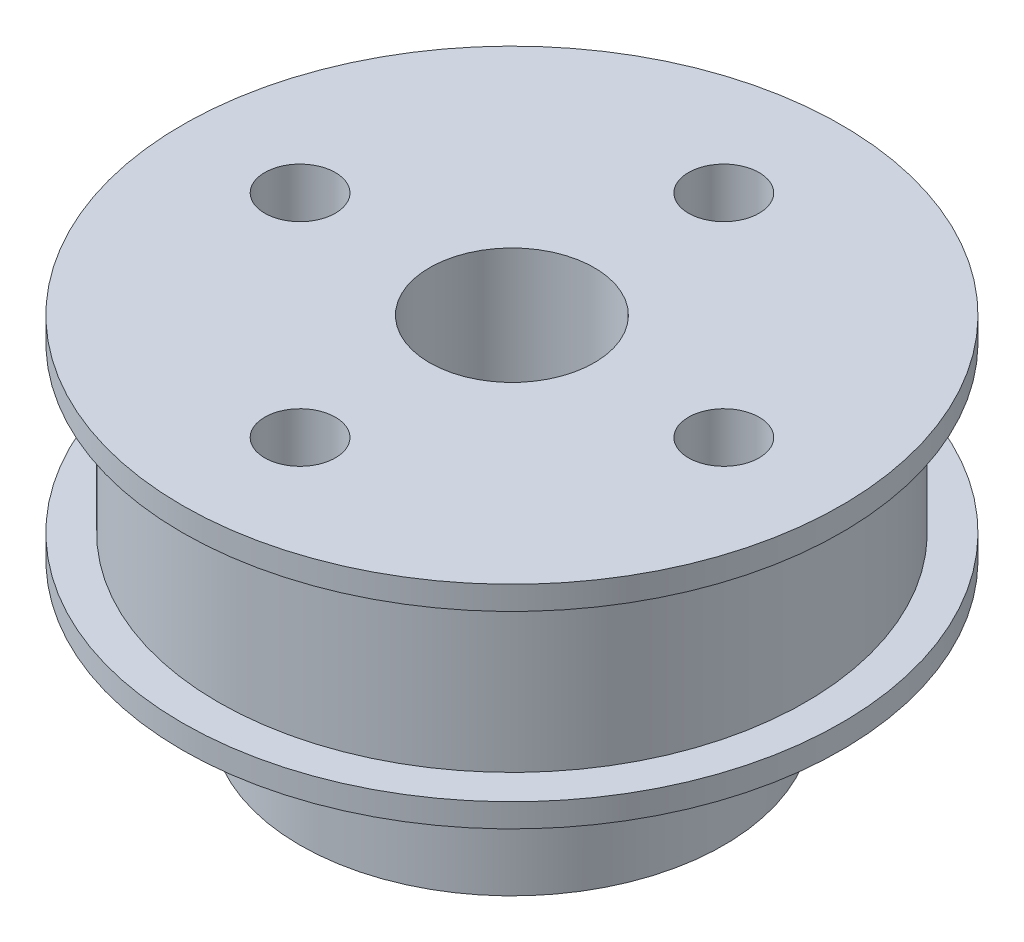
ISO-10303-21;
HEADER;
FILE_DESCRIPTION(('STEP AP214'),'2;1');
FILE_NAME('part.step','',(''),(''),'','','');
FILE_SCHEMA(('AUTOMOTIVE_DESIGN { 1 0 10303 214 1 1 1 1 }'));
ENDSEC;
DATA;
#1=APPLICATION_CONTEXT('core data for automotive mechanical design processes');
#2=APPLICATION_PROTOCOL_DEFINITION('international standard','automotive_design',2000,#1);
#3=PRODUCT_CONTEXT('',#1,'mechanical');
#4=PRODUCT('Part','Part','',(#3));
#5=PRODUCT_RELATED_PRODUCT_CATEGORY('part','',(#4));
#6=PRODUCT_DEFINITION_FORMATION('','',#4);
#7=PRODUCT_DEFINITION_CONTEXT('part definition',#1,'design');
#8=PRODUCT_DEFINITION('design','',#6,#7);
#9=PRODUCT_DEFINITION_SHAPE('','',#8);
#10=(LENGTH_UNIT() NAMED_UNIT(*) SI_UNIT(.MILLI.,.METRE.));
#11=(NAMED_UNIT(*) PLANE_ANGLE_UNIT() SI_UNIT($,.RADIAN.));
#12=(NAMED_UNIT(*) SI_UNIT($,.STERADIAN.) SOLID_ANGLE_UNIT());
#13=UNCERTAINTY_MEASURE_WITH_UNIT(LENGTH_MEASURE(1.E-05),#10,'distance_accuracy_value','');
#14=(GEOMETRIC_REPRESENTATION_CONTEXT(3) GLOBAL_UNCERTAINTY_ASSIGNED_CONTEXT((#13)) GLOBAL_UNIT_ASSIGNED_CONTEXT((#10,
#11,#12)) REPRESENTATION_CONTEXT('',''));
#15=CARTESIAN_POINT('',(0.,0.,0.));
#16=DIRECTION('',(0.,0.,1.));
#17=DIRECTION('',(1.,0.,0.));
#18=AXIS2_PLACEMENT_3D('',#15,#16,#17);
#19=CARTESIAN_POINT('',(0.,1.,0.));
#20=DIRECTION('',(0.,-1.,0.));
#21=DIRECTION('',(0.,0.,-1.));
#22=AXIS2_PLACEMENT_3D('',#19,#20,#21);
#23=CYLINDRICAL_SURFACE('',#22,14.);
#24=CARTESIAN_POINT('',(0.,1.,0.));
#25=DIRECTION('',(0.,1.,0.));
#26=DIRECTION('',(0.,0.,1.));
#27=AXIS2_PLACEMENT_3D('',#24,#25,#26);
#28=CIRCLE('',#27,14.);
#29=CARTESIAN_POINT('',(0.,1.,14.));
#30=VERTEX_POINT('',#29);
#31=EDGE_CURVE('E103',#30,#30,#28,.T.);
#32=ORIENTED_EDGE('',*,*,#31,.F.);
#33=EDGE_LOOP('',(#32));
#34=FACE_BOUND('',#33,.T.);
#35=CARTESIAN_POINT('',(0.,0.,0.));
#36=DIRECTION('',(0.,1.,0.));
#37=DIRECTION('',(0.,0.,1.));
#38=AXIS2_PLACEMENT_3D('',#35,#36,#37);
#39=CIRCLE('',#38,14.);
#40=CARTESIAN_POINT('',(0.,0.,14.));
#41=VERTEX_POINT('',#40);
#42=EDGE_CURVE('E36',#41,#41,#39,.T.);
#43=ORIENTED_EDGE('',*,*,#42,.T.);
#44=EDGE_LOOP('',(#43));
#45=FACE_BOUND('',#44,.T.);
#46=ADVANCED_FACE('F33',(#34,#45),#23,.T.);
#47=CARTESIAN_POINT('',(0.,1.,0.));
#48=DIRECTION('',(0.,1.,0.));
#49=DIRECTION('',(0.,0.,1.));
#50=AXIS2_PLACEMENT_3D('',#47,#48,#49);
#51=PLANE('',#50);
#52=CARTESIAN_POINT('',(0.,1.,0.));
#53=DIRECTION('',(0.,1.,0.));
#54=DIRECTION('',(0.,0.,1.));
#55=AXIS2_PLACEMENT_3D('',#52,#53,#54);
#56=CIRCLE('',#55,12.475);
#57=CARTESIAN_POINT('',(0.,1.,12.475));
#58=VERTEX_POINT('',#57);
#59=EDGE_CURVE('E101',#58,#58,#56,.T.);
#60=ORIENTED_EDGE('',*,*,#59,.F.);
#61=EDGE_LOOP('',(#60));
#62=FACE_BOUND('',#61,.T.);
#63=ORIENTED_EDGE('',*,*,#31,.T.);
#64=EDGE_LOOP('',(#63));
#65=FACE_BOUND('',#64,.T.);
#66=ADVANCED_FACE('F152',(#62,#65),#51,.T.);
#67=CARTESIAN_POINT('',(0.,0.,0.));
#68=DIRECTION('',(0.,1.,0.));
#69=DIRECTION('',(0.,0.,1.));
#70=AXIS2_PLACEMENT_3D('',#67,#68,#69);
#71=PLANE('',#70);
#72=CARTESIAN_POINT('',(0.,0.,0.));
#73=DIRECTION('',(0.,-1.,0.));
#74=DIRECTION('',(0.,0.,-1.));
#75=AXIS2_PLACEMENT_3D('',#72,#73,#74);
#76=CIRCLE('',#75,9.);
#77=CARTESIAN_POINT('',(1.49478259288767,0.,-8.875));
#78=VERTEX_POINT('',#77);
#79=CARTESIAN_POINT('',(8.875,0.,-1.49478259288764));
#80=VERTEX_POINT('',#79);
#81=EDGE_CURVE('E50',#78,#80,#76,.T.);
#82=ORIENTED_EDGE('',*,*,#81,.F.);
#83=CARTESIAN_POINT('',(0.,0.,-9.));
#84=DIRECTION('',(0.,1.,0.));
#85=DIRECTION('',(0.,0.,1.));
#86=AXIS2_PLACEMENT_3D('',#83,#84,#85);
#87=CIRCLE('',#86,1.5);
#88=CARTESIAN_POINT('',(-1.49478259288767,0.,-8.875));
#89=VERTEX_POINT('',#88);
#90=EDGE_CURVE('E75',#78,#89,#87,.T.);
#91=ORIENTED_EDGE('',*,*,#90,.T.);
#92=CARTESIAN_POINT('',(-8.87499999999998,0.,-1.49478259288777));
#93=VERTEX_POINT('',#92);
#94=EDGE_CURVE('E80',#93,#89,#76,.T.);
#95=ORIENTED_EDGE('',*,*,#94,.F.);
#96=CARTESIAN_POINT('',(-9.,0.,0.));
#97=DIRECTION('',(0.,1.,0.));
#98=DIRECTION('',(1.,0.,0.));
#99=AXIS2_PLACEMENT_3D('',#96,#97,#98);
#100=CIRCLE('',#99,1.5);
#101=CARTESIAN_POINT('',(-8.87500000000001,0.,1.49478259288758));
#102=VERTEX_POINT('',#101);
#103=EDGE_CURVE('E127',#93,#102,#100,.T.);
#104=ORIENTED_EDGE('',*,*,#103,.T.);
#105=CARTESIAN_POINT('',(-1.49478259288767,0.,8.875));
#106=VERTEX_POINT('',#105);
#107=EDGE_CURVE('E41',#106,#102,#76,.T.);
#108=ORIENTED_EDGE('',*,*,#107,.F.);
#109=CARTESIAN_POINT('',(0.,0.,9.));
#110=DIRECTION('',(0.,1.,0.));
#111=DIRECTION('',(0.,0.,-1.));
#112=AXIS2_PLACEMENT_3D('',#109,#110,#111);
#113=CIRCLE('',#112,1.5);
#114=CARTESIAN_POINT('',(1.49478259288767,0.,8.875));
#115=VERTEX_POINT('',#114);
#116=EDGE_CURVE('E122',#106,#115,#113,.T.);
#117=ORIENTED_EDGE('',*,*,#116,.T.);
#118=CARTESIAN_POINT('',(8.87499999999999,0.,1.49478259288771));
#119=VERTEX_POINT('',#118);
#120=EDGE_CURVE('E11',#119,#115,#76,.T.);
#121=ORIENTED_EDGE('',*,*,#120,.F.);
#122=CARTESIAN_POINT('',(9.,0.,0.));
#123=DIRECTION('',(0.,1.,0.));
#124=DIRECTION('',(-1.,0.,0.));
#125=AXIS2_PLACEMENT_3D('',#122,#123,#124);
#126=CIRCLE('',#125,1.5);
#127=EDGE_CURVE('E136',#119,#80,#126,.T.);
#128=ORIENTED_EDGE('',*,*,#127,.T.);
#129=EDGE_LOOP('',(#82,#91,#95,#104,#108,#117,#121,#128));
#130=FACE_BOUND('',#129,.T.);
#131=ORIENTED_EDGE('',*,*,#42,.F.);
#132=EDGE_LOOP('',(#131));
#133=FACE_BOUND('',#132,.T.);
#134=ADVANCED_FACE('F77',(#130,#133),#71,.F.);
#135=CARTESIAN_POINT('',(0.,8.,0.));
#136=DIRECTION('',(0.,-1.,0.));
#137=DIRECTION('',(0.,0.,-1.));
#138=AXIS2_PLACEMENT_3D('',#135,#136,#137);
#139=CYLINDRICAL_SURFACE('',#138,12.475);
#140=CARTESIAN_POINT('',(0.,8.,0.));
#141=DIRECTION('',(0.,1.,0.));
#142=DIRECTION('',(0.,0.,1.));
#143=AXIS2_PLACEMENT_3D('',#140,#141,#142);
#144=CIRCLE('',#143,12.475);
#145=CARTESIAN_POINT('',(0.,8.,12.475));
#146=VERTEX_POINT('',#145);
#147=EDGE_CURVE('E140',#146,#146,#144,.T.);
#148=ORIENTED_EDGE('',*,*,#147,.F.);
#149=EDGE_LOOP('',(#148));
#150=FACE_BOUND('',#149,.T.);
#151=ORIENTED_EDGE('',*,*,#59,.T.);
#152=EDGE_LOOP('',(#151));
#153=FACE_BOUND('',#152,.T.);
#154=ADVANCED_FACE('F151',(#150,#153),#139,.T.);
#155=CARTESIAN_POINT('',(0.,9.,0.));
#156=DIRECTION('',(0.,-1.,0.));
#157=DIRECTION('',(0.,0.,-1.));
#158=AXIS2_PLACEMENT_3D('',#155,#156,#157);
#159=CYLINDRICAL_SURFACE('',#158,14.);
#160=CARTESIAN_POINT('',(0.,9.,0.));
#161=DIRECTION('',(0.,1.,0.));
#162=DIRECTION('',(0.,0.,1.));
#163=AXIS2_PLACEMENT_3D('',#160,#161,#162);
#164=CIRCLE('',#163,14.);
#165=CARTESIAN_POINT('',(0.,9.,14.));
#166=VERTEX_POINT('',#165);
#167=EDGE_CURVE('E137',#166,#166,#164,.T.);
#168=ORIENTED_EDGE('',*,*,#167,.F.);
#169=EDGE_LOOP('',(#168));
#170=FACE_BOUND('',#169,.T.);
#171=CARTESIAN_POINT('',(0.,8.,0.));
#172=DIRECTION('',(0.,1.,0.));
#173=DIRECTION('',(0.,0.,1.));
#174=AXIS2_PLACEMENT_3D('',#171,#172,#173);
#175=CIRCLE('',#174,14.);
#176=CARTESIAN_POINT('',(0.,8.,14.));
#177=VERTEX_POINT('',#176);
#178=EDGE_CURVE('E83',#177,#177,#175,.T.);
#179=ORIENTED_EDGE('',*,*,#178,.T.);
#180=EDGE_LOOP('',(#179));
#181=FACE_BOUND('',#180,.T.);
#182=ADVANCED_FACE('F157',(#170,#181),#159,.T.);
#183=CARTESIAN_POINT('',(0.,9.,0.));
#184=DIRECTION('',(0.,1.,0.));
#185=DIRECTION('',(0.,0.,1.));
#186=AXIS2_PLACEMENT_3D('',#183,#184,#185);
#187=PLANE('',#186);
#188=CARTESIAN_POINT('',(0.,9.,0.));
#189=DIRECTION('',(0.,1.,0.));
#190=DIRECTION('',(0.,0.,1.));
#191=AXIS2_PLACEMENT_3D('',#188,#189,#190);
#192=CIRCLE('',#191,3.5);
#193=CARTESIAN_POINT('',(0.,9.,3.5));
#194=VERTEX_POINT('',#193);
#195=EDGE_CURVE('E337',#194,#194,#192,.T.);
#196=ORIENTED_EDGE('',*,*,#195,.F.);
#197=EDGE_LOOP('',(#196));
#198=FACE_BOUND('',#197,.T.);
#199=CARTESIAN_POINT('',(9.,9.,0.));
#200=DIRECTION('',(0.,1.,0.));
#201=DIRECTION('',(-1.,0.,0.));
#202=AXIS2_PLACEMENT_3D('',#199,#200,#201);
#203=CIRCLE('',#202,1.5);
#204=CARTESIAN_POINT('',(7.5,9.,0.));
#205=VERTEX_POINT('',#204);
#206=EDGE_CURVE('E125',#205,#205,#203,.T.);
#207=ORIENTED_EDGE('',*,*,#206,.F.);
#208=EDGE_LOOP('',(#207));
#209=FACE_BOUND('',#208,.T.);
#210=CARTESIAN_POINT('',(0.,9.,9.));
#211=DIRECTION('',(0.,1.,0.));
#212=DIRECTION('',(0.,0.,-1.));
#213=AXIS2_PLACEMENT_3D('',#210,#211,#212);
#214=CIRCLE('',#213,1.5);
#215=CARTESIAN_POINT('',(0.,9.,7.5));
#216=VERTEX_POINT('',#215);
#217=EDGE_CURVE('E123',#216,#216,#214,.T.);
#218=ORIENTED_EDGE('',*,*,#217,.F.);
#219=EDGE_LOOP('',(#218));
#220=FACE_BOUND('',#219,.T.);
#221=CARTESIAN_POINT('',(-9.,9.,0.));
#222=DIRECTION('',(0.,1.,0.));
#223=DIRECTION('',(1.,0.,0.));
#224=AXIS2_PLACEMENT_3D('',#221,#222,#223);
#225=CIRCLE('',#224,1.5);
#226=CARTESIAN_POINT('',(-7.5,9.,0.));
#227=VERTEX_POINT('',#226);
#228=EDGE_CURVE('E110',#227,#227,#225,.T.);
#229=ORIENTED_EDGE('',*,*,#228,.F.);
#230=EDGE_LOOP('',(#229));
#231=FACE_BOUND('',#230,.T.);
#232=CARTESIAN_POINT('',(0.,9.,-9.));
#233=DIRECTION('',(0.,1.,0.));
#234=DIRECTION('',(0.,0.,1.));
#235=AXIS2_PLACEMENT_3D('',#232,#233,#234);
#236=CIRCLE('',#235,1.5);
#237=CARTESIAN_POINT('',(0.,9.,-7.5));
#238=VERTEX_POINT('',#237);
#239=EDGE_CURVE('E91',#238,#238,#236,.T.);
#240=ORIENTED_EDGE('',*,*,#239,.F.);
#241=EDGE_LOOP('',(#240));
#242=FACE_BOUND('',#241,.T.);
#243=ORIENTED_EDGE('',*,*,#167,.T.);
#244=EDGE_LOOP('',(#243));
#245=FACE_BOUND('',#244,.T.);
#246=ADVANCED_FACE('F186',(#198,#209,#220,#231,#242,#245),#187,.T.);
#247=CARTESIAN_POINT('',(0.,8.,0.));
#248=DIRECTION('',(0.,1.,0.));
#249=DIRECTION('',(0.,0.,1.));
#250=AXIS2_PLACEMENT_3D('',#247,#248,#249);
#251=PLANE('',#250);
#252=ORIENTED_EDGE('',*,*,#147,.T.);
#253=EDGE_LOOP('',(#252));
#254=FACE_BOUND('',#253,.T.);
#255=ORIENTED_EDGE('',*,*,#178,.F.);
#256=EDGE_LOOP('',(#255));
#257=FACE_BOUND('',#256,.T.);
#258=ADVANCED_FACE('F194',(#254,#257),#251,.F.);
#259=CARTESIAN_POINT('',(0.,0.,-9.));
#260=DIRECTION('',(0.,1.,0.));
#261=DIRECTION('',(0.,0.,1.));
#262=AXIS2_PLACEMENT_3D('',#259,#260,#261);
#263=CYLINDRICAL_SURFACE('',#262,1.5);
#264=ORIENTED_EDGE('',*,*,#90,.F.);
#265=EDGE_CURVE('E84',#89,#78,#87,.T.);
#266=ORIENTED_EDGE('',*,*,#265,.F.);
#267=EDGE_LOOP('',(#264,#266));
#268=FACE_BOUND('',#267,.T.);
#269=ORIENTED_EDGE('',*,*,#239,.T.);
#270=EDGE_LOOP('',(#269));
#271=FACE_BOUND('',#270,.T.);
#272=ADVANCED_FACE('F87',(#268,#271),#263,.F.);
#273=CARTESIAN_POINT('',(-9.,0.,0.));
#274=DIRECTION('',(0.,1.,0.));
#275=DIRECTION('',(0.,0.,1.));
#276=AXIS2_PLACEMENT_3D('',#273,#274,#275);
#277=CYLINDRICAL_SURFACE('',#276,1.5);
#278=ORIENTED_EDGE('',*,*,#103,.F.);
#279=EDGE_CURVE('E57',#102,#93,#100,.T.);
#280=ORIENTED_EDGE('',*,*,#279,.F.);
#281=EDGE_LOOP('',(#278,#280));
#282=FACE_BOUND('',#281,.T.);
#283=ORIENTED_EDGE('',*,*,#228,.T.);
#284=EDGE_LOOP('',(#283));
#285=FACE_BOUND('',#284,.T.);
#286=ADVANCED_FACE('F211',(#282,#285),#277,.F.);
#287=CARTESIAN_POINT('',(0.,0.,9.));
#288=DIRECTION('',(0.,1.,0.));
#289=DIRECTION('',(0.,0.,1.));
#290=AXIS2_PLACEMENT_3D('',#287,#288,#289);
#291=CYLINDRICAL_SURFACE('',#290,1.5);
#292=ORIENTED_EDGE('',*,*,#116,.F.);
#293=EDGE_CURVE('E118',#115,#106,#113,.T.);
#294=ORIENTED_EDGE('',*,*,#293,.F.);
#295=EDGE_LOOP('',(#292,#294));
#296=FACE_BOUND('',#295,.T.);
#297=ORIENTED_EDGE('',*,*,#217,.T.);
#298=EDGE_LOOP('',(#297));
#299=FACE_BOUND('',#298,.T.);
#300=ADVANCED_FACE('F220',(#296,#299),#291,.F.);
#301=CARTESIAN_POINT('',(9.,0.,0.));
#302=DIRECTION('',(0.,1.,0.));
#303=DIRECTION('',(0.,0.,1.));
#304=AXIS2_PLACEMENT_3D('',#301,#302,#303);
#305=CYLINDRICAL_SURFACE('',#304,1.5);
#306=ORIENTED_EDGE('',*,*,#127,.F.);
#307=EDGE_CURVE('E361',#80,#119,#126,.T.);
#308=ORIENTED_EDGE('',*,*,#307,.F.);
#309=EDGE_LOOP('',(#306,#308));
#310=FACE_BOUND('',#309,.T.);
#311=ORIENTED_EDGE('',*,*,#206,.T.);
#312=EDGE_LOOP('',(#311));
#313=FACE_BOUND('',#312,.T.);
#314=ADVANCED_FACE('F229',(#310,#313),#305,.F.);
#315=CARTESIAN_POINT('',(0.,0.,0.));
#316=DIRECTION('',(0.,-1.,0.));
#317=DIRECTION('',(0.,0.,-1.));
#318=AXIS2_PLACEMENT_3D('',#315,#316,#317);
#319=PLANE('',#318);
#320=EDGE_CURVE('E43',#80,#119,#76,.T.);
#321=ORIENTED_EDGE('',*,*,#320,.F.);
#322=ORIENTED_EDGE('',*,*,#307,.T.);
#323=EDGE_LOOP('',(#321,#322));
#324=FACE_BOUND('',#323,.T.);
#325=ADVANCED_FACE('F238',(#324),#319,.F.);
#326=EDGE_CURVE('E111',#115,#106,#76,.T.);
#327=ORIENTED_EDGE('',*,*,#326,.F.);
#328=ORIENTED_EDGE('',*,*,#293,.T.);
#329=EDGE_LOOP('',(#327,#328));
#330=FACE_BOUND('',#329,.T.);
#331=ADVANCED_FACE('F117',(#330),#319,.F.);
#332=EDGE_CURVE('E95',#102,#93,#76,.T.);
#333=ORIENTED_EDGE('',*,*,#332,.F.);
#334=ORIENTED_EDGE('',*,*,#279,.T.);
#335=EDGE_LOOP('',(#333,#334));
#336=FACE_BOUND('',#335,.T.);
#337=ADVANCED_FACE('F257',(#336),#319,.F.);
#338=EDGE_CURVE('E92',#89,#78,#76,.T.);
#339=ORIENTED_EDGE('',*,*,#338,.F.);
#340=ORIENTED_EDGE('',*,*,#265,.T.);
#341=EDGE_LOOP('',(#339,#340));
#342=FACE_BOUND('',#341,.T.);
#343=ADVANCED_FACE('F93',(#342),#319,.F.);
#344=CARTESIAN_POINT('',(0.,-6.,0.));
#345=DIRECTION('',(0.,1.,0.));
#346=DIRECTION('',(0.,0.,1.));
#347=AXIS2_PLACEMENT_3D('',#344,#345,#346);
#348=CYLINDRICAL_SURFACE('',#347,9.);
#349=CARTESIAN_POINT('',(5.19008566149192,-3.,-7.35275532208001));
#350=CARTESIAN_POINT('',(5.19008910989625,-3.08362544888762,-7.3527540244495));
#351=CARTESIAN_POINT('',(5.19590580246902,-3.16729656361492,-7.34865769296106));
#352=CARTESIAN_POINT('',(5.21893851308184,-3.3322911259321,-7.33231700013169));
#353=CARTESIAN_POINT('',(5.23616504361847,-3.41361233624971,-7.3200651245978));
#354=CARTESIAN_POINT('',(5.28127464737182,-3.57149537001406,-7.28758569114823));
#355=CARTESIAN_POINT('',(5.30914881417755,-3.64806110919978,-7.26736479861634));
#356=CARTESIAN_POINT('',(5.37442687963934,-3.79438857282822,-7.21922245984875));
#357=CARTESIAN_POINT('',(5.41182970585878,-3.86415106174574,-7.19130188017238));
#358=CARTESIAN_POINT('',(5.49510970179502,-3.99558770984739,-7.12786963333173));
#359=CARTESIAN_POINT('',(5.54105872580818,-4.0571850788319,-7.092293166397));
#360=CARTESIAN_POINT('',(5.63952497952422,-4.1698759841169,-7.01424957133064));
#361=CARTESIAN_POINT('',(5.69204259821941,-4.2209688978692,-6.97178203506541));
#362=CARTESIAN_POINT('',(5.80213405366162,-4.3114887403316,-6.8804345089211));
#363=CARTESIAN_POINT('',(5.859736203344,-4.35084420463909,-6.83151775149005));
#364=CARTESIAN_POINT('',(5.97775383960591,-4.41631264231831,-6.72849071036477));
#365=CARTESIAN_POINT('',(6.0381691429803,-4.44242647673091,-6.6743807646313));
#366=CARTESIAN_POINT('',(6.15926308004895,-4.48043552099033,-6.56278841172695));
#367=CARTESIAN_POINT('',(6.21993413569002,-4.49245974960281,-6.5053417439322));
#368=CARTESIAN_POINT('',(6.34021622674222,-4.50234945249155,-6.38816913842503));
#369=CARTESIAN_POINT('',(6.3998273339275,-4.50021588914833,-6.32844335591058));
#370=CARTESIAN_POINT('',(6.51570407324275,-4.48195118908307,-6.20906234034869));
#371=CARTESIAN_POINT('',(6.57199699303788,-4.4659589019545,-6.14941226769596));
#372=CARTESIAN_POINT('',(6.68044283768535,-4.4206493554521,-6.03142672369306));
#373=CARTESIAN_POINT('',(6.73259563639112,-4.39133169024629,-5.97309129243784));
#374=CARTESIAN_POINT('',(6.83182026642094,-4.3200656158108,-5.85934807529185));
#375=CARTESIAN_POINT('',(6.87886774192839,-4.27805999275053,-5.803954916084));
#376=CARTESIAN_POINT('',(6.96669084202523,-4.18265230641896,-5.69824085262331));
#377=CARTESIAN_POINT('',(7.00746595854069,-4.1292493207735,-5.6479203593805));
#378=CARTESIAN_POINT('',(7.08250499287856,-4.01179271602841,-5.55354022822141));
#379=CARTESIAN_POINT('',(7.11668391491437,-3.94761774305941,-5.50956395386528));
#380=CARTESIAN_POINT('',(7.1773785347992,-3.81084774587051,-5.43026139614705));
#381=CARTESIAN_POINT('',(7.20389416196045,-3.73825264399031,-5.39493519257539));
#382=CARTESIAN_POINT('',(7.24890696420422,-3.58656501487351,-5.33430241433044));
#383=CARTESIAN_POINT('',(7.26739512479934,-3.50746530114474,-5.30900710665464));
#384=CARTESIAN_POINT('',(7.29604834171615,-3.34509055661547,-5.26956153052164));
#385=CARTESIAN_POINT('',(7.3062141308941,-3.26181589414055,-5.25541028073862));
#386=CARTESIAN_POINT('',(7.31801148989919,-3.09452030630272,-5.23897035712016));
#387=CARTESIAN_POINT('',(7.31974353608764,-3.01052017217874,-5.23654202397785));
#388=CARTESIAN_POINT('',(7.31492203866509,-2.84322799698551,-5.24327493690184));
#389=CARTESIAN_POINT('',(7.30836881508084,-2.75993592869162,-5.25243573532645));
#390=CARTESIAN_POINT('',(7.28713533834684,-2.59696334448549,-5.2818539218041));
#391=CARTESIAN_POINT('',(7.2725067559042,-2.5172633160732,-5.30204075050738));
#392=CARTESIAN_POINT('',(7.23535572671723,-2.36311790023231,-5.35262612337613));
#393=CARTESIAN_POINT('',(7.21283280774244,-2.28867282746946,-5.38302527842712));
#394=CARTESIAN_POINT('',(7.15995641226468,-2.14639524335634,-5.45316086186297));
#395=CARTESIAN_POINT('',(7.12953262659598,-2.07863005634637,-5.49298082657222));
#396=CARTESIAN_POINT('',(7.06139958300597,-1.95233188038301,-5.58029524805608));
#397=CARTESIAN_POINT('',(7.02368981263603,-1.89379954133416,-5.62779024460387));
#398=CARTESIAN_POINT('',(6.94116201805539,-1.78700886436279,-5.72927423667878));
#399=CARTESIAN_POINT('',(6.89627414816859,-1.73886370422928,-5.78332563145212));
#400=CARTESIAN_POINT('',(6.80052199834847,-1.65500680379708,-5.89562018242331));
#401=CARTESIAN_POINT('',(6.74965791180473,-1.6192946613157,-5.95386320295708));
#402=CARTESIAN_POINT('',(6.64329547227194,-1.56149364962709,-6.07230825029715));
#403=CARTESIAN_POINT('',(6.58781848517928,-1.53934555455906,-6.13250053456205));
#404=CARTESIAN_POINT('',(6.47341888773351,-1.50911064062171,-6.25313946867152));
#405=CARTESIAN_POINT('',(6.41449656130609,-1.50102266476059,-6.31358609717599));
#406=CARTESIAN_POINT('',(6.2955714536774,-1.4991708706127,-6.43216504039398));
#407=CARTESIAN_POINT('',(6.23559038460299,-1.50523484763538,-6.49031651232273));
#408=CARTESIAN_POINT('',(6.11563584603977,-1.53114235336165,-6.60346867759652));
#409=CARTESIAN_POINT('',(6.0556623765103,-1.55098580490575,-6.65846938858268));
#410=CARTESIAN_POINT('',(5.93766346487565,-1.60382289932626,-6.76390503837779));
#411=CARTESIAN_POINT('',(5.87963593158666,-1.63680190092628,-6.81434498420182));
#412=CARTESIAN_POINT('',(5.76733813574264,-1.71495476173812,-6.90964842435332));
#413=CARTESIAN_POINT('',(5.71306805145104,-1.76012919903659,-6.95451165418667));
#414=CARTESIAN_POINT('',(5.60951816758738,-1.86200105547721,-7.03830943540638));
#415=CARTESIAN_POINT('',(5.56030267079617,-1.91882457285413,-7.07717016697435));
#416=CARTESIAN_POINT('',(5.46933462129483,-2.04211698473892,-7.14770597341135));
#417=CARTESIAN_POINT('',(5.42758381930611,-2.10858813533493,-7.17937936307516));
#418=CARTESIAN_POINT('',(5.35286920884929,-2.24984719350459,-7.23526016455763));
#419=CARTESIAN_POINT('',(5.31996964426867,-2.32469060390283,-7.25941318092804));
#420=CARTESIAN_POINT('',(5.26471034307582,-2.48016554154687,-7.29958917503419));
#421=CARTESIAN_POINT('',(5.24234007799048,-2.56079119361814,-7.31562027527942));
#422=CARTESIAN_POINT('',(5.21390945408308,-2.701442261686,-7.33589459818792));
#423=CARTESIAN_POINT('',(5.20499491539382,-2.76061608477506,-7.3422123070294));
#424=CARTESIAN_POINT('',(5.1930818339404,-2.87985209090467,-7.35064309699074));
#425=CARTESIAN_POINT('',(5.19008318377807,-2.9399142577981,-7.35275625444084));
#426=CARTESIAN_POINT('',(5.19008566149192,-3.,-7.35275532208001));
#427=B_SPLINE_CURVE_WITH_KNOTS('',3,(#349,#350,#351,#352,#353,#354,#355,#356,#357,#358,#359,
#360,#361,#362,#363,#364,#365,#366,#367,#368,#369,#370,#371,#372,#373,#374,#375,#376,#377,#378,
#379,#380,#381,#382,#383,#384,#385,#386,#387,#388,#389,#390,#391,#392,#393,#394,#395,#396,#397,
#398,#399,#400,#401,#402,#403,#404,#405,#406,#407,#408,#409,#410,#411,#412,#413,#414,#415,#416,
#417,#418,#419,#420,#421,#422,#423,#424,#425,#426),.UNSPECIFIED.,.T.,.F.,(4,2,2,2,2,2,2,2,2,2,2,
2,2,2,2,2,2,2,2,2,2,2,2,2,2,2,2,2,2,2,2,2,2,2,2,2,2,2,4),(0.,0.250656623343189,
0.501544511951665,0.752222998698994,1.00287328440552,1.25573495490817,1.50861160698056,
1.76299788064248,2.01736761064055,2.26938940480926,2.52139406789002,2.77090272696188,
3.02041898547106,3.27107762481042,3.52175655733445,3.7754767407466,4.02919926444997,
4.28320597496548,4.53719031560232,4.78814125449632,5.03908250045771,5.2884363877868,
5.5378051937353,5.78947405655006,6.04116062655798,6.29546467818613,6.54976050283403,
6.80293790647972,7.05609447544794,7.30618665756934,7.55627743928678,7.80609023896857,
8.05591488232785,8.30860198475334,8.5613482732647,8.81588236567704,9.0701614004257,
9.25026402322156,9.43036337636988),.UNSPECIFIED.);
#428=CARTESIAN_POINT('',(5.19008566149192,-3.,-7.35275532208001));
#429=VERTEX_POINT('',#428);
#430=EDGE_CURVE('E331',#429,#429,#427,.T.);
#431=ORIENTED_EDGE('',*,*,#430,.T.);
#432=EDGE_LOOP('',(#431));
#433=FACE_BOUND('',#432,.T.);
#434=CARTESIAN_POINT('',(0.,-6.,0.));
#435=DIRECTION('',(0.,-1.,0.));
#436=DIRECTION('',(0.,0.,-1.));
#437=AXIS2_PLACEMENT_3D('',#434,#435,#436);
#438=CIRCLE('',#437,9.);
#439=CARTESIAN_POINT('',(0.,-6.,-9.));
#440=VERTEX_POINT('',#439);
#441=EDGE_CURVE('E107',#440,#440,#438,.T.);
#442=ORIENTED_EDGE('',*,*,#441,.F.);
#443=EDGE_LOOP('',(#442));
#444=FACE_BOUND('',#443,.T.);
#445=ORIENTED_EDGE('',*,*,#81,.T.);
#446=ORIENTED_EDGE('',*,*,#320,.T.);
#447=ORIENTED_EDGE('',*,*,#120,.T.);
#448=ORIENTED_EDGE('',*,*,#326,.T.);
#449=ORIENTED_EDGE('',*,*,#107,.T.);
#450=ORIENTED_EDGE('',*,*,#332,.T.);
#451=ORIENTED_EDGE('',*,*,#94,.T.);
#452=ORIENTED_EDGE('',*,*,#338,.T.);
#453=EDGE_LOOP('',(#445,#446,#447,#448,#449,#450,#451,#452));
#454=FACE_BOUND('',#453,.T.);
#455=ADVANCED_FACE('F98',(#433,#444,#454),#348,.T.);
#456=CARTESIAN_POINT('',(0.,-6.,0.));
#457=DIRECTION('',(0.,-1.,0.));
#458=DIRECTION('',(0.,0.,-1.));
#459=AXIS2_PLACEMENT_3D('',#456,#457,#458);
#460=PLANE('',#459);
#461=CARTESIAN_POINT('',(0.,-6.,0.));
#462=DIRECTION('',(0.,1.,0.));
#463=DIRECTION('',(0.,0.,1.));
#464=AXIS2_PLACEMENT_3D('',#461,#462,#463);
#465=CIRCLE('',#464,3.5);
#466=CARTESIAN_POINT('',(0.,-6.,3.5));
#467=VERTEX_POINT('',#466);
#468=EDGE_CURVE('E96',#467,#467,#465,.T.);
#469=ORIENTED_EDGE('',*,*,#468,.T.);
#470=EDGE_LOOP('',(#469));
#471=FACE_BOUND('',#470,.T.);
#472=ORIENTED_EDGE('',*,*,#441,.T.);
#473=EDGE_LOOP('',(#472));
#474=FACE_BOUND('',#473,.T.);
#475=ADVANCED_FACE('F285',(#471,#474),#460,.T.);
#476=CARTESIAN_POINT('',(0.,-6.,0.));
#477=DIRECTION('',(0.,1.,0.));
#478=DIRECTION('',(0.,0.,1.));
#479=AXIS2_PLACEMENT_3D('',#476,#477,#478);
#480=CYLINDRICAL_SURFACE('',#479,3.5);
#481=CARTESIAN_POINT('',(1.16453636088771,-3.,-3.30058404894806));
#482=CARTESIAN_POINT('',(1.16454988651493,-2.92023106695462,-3.300584021218));
#483=CARTESIAN_POINT('',(1.17123752170308,-2.84034185835809,-3.2982437670589));
#484=CARTESIAN_POINT('',(1.19753179915679,-2.68288333692637,-3.28878377416247));
#485=CARTESIAN_POINT('',(1.21717256888124,-2.60532071986145,-3.28165140877622));
#486=CARTESIAN_POINT('',(1.26790060404916,-2.4550840582022,-3.26238491348017));
#487=CARTESIAN_POINT('',(1.29893935139745,-2.38239081465564,-3.25027195879708));
#488=CARTESIAN_POINT('',(1.3706709049663,-2.24318207056435,-3.22067705126092));
#489=CARTESIAN_POINT('',(1.41136181611484,-2.17666536090325,-3.20319615213305));
#490=CARTESIAN_POINT('',(1.50317909608336,-2.04727508438348,-3.16119378499447));
#491=CARTESIAN_POINT('',(1.55478400509596,-1.98485726918466,-3.13631379255964));
#492=CARTESIAN_POINT('',(1.66449249045356,-1.86964866759959,-3.079493382983));
#493=CARTESIAN_POINT('',(1.72259864367284,-1.81686172052883,-3.04755016128242));
#494=CARTESIAN_POINT('',(1.84586329226764,-1.72004049536428,-2.97458311322689));
#495=CARTESIAN_POINT('',(1.91122384490693,-1.6765254048694,-2.93320698124096));
#496=CARTESIAN_POINT('',(2.04389320837921,-1.60301788578415,-2.84234919194359));
#497=CARTESIAN_POINT('',(2.11120109101744,-1.57301912406741,-2.79287134556872));
#498=CARTESIAN_POINT('',(2.24130746445788,-1.52906748943891,-2.6894357513186));
#499=CARTESIAN_POINT('',(2.30415129526319,-1.51432696751714,-2.63587086211258));
#500=CARTESIAN_POINT('',(2.42674249696202,-1.49875864960563,-2.52345505666936));
#501=CARTESIAN_POINT('',(2.48649119017524,-1.49792486262185,-2.46460642764248));
#502=CARTESIAN_POINT('',(2.59721962957297,-1.5097951243902,-2.34745253281055));
#503=CARTESIAN_POINT('',(2.64851620785861,-1.52163189997451,-2.28935576211558));
#504=CARTESIAN_POINT('',(2.7455147881777,-1.55701203432744,-2.17208230365502));
#505=CARTESIAN_POINT('',(2.79121637646049,-1.58055625821337,-2.11290553639483));
#506=CARTESIAN_POINT('',(2.87703251844183,-1.63895329486282,-1.99452137831086));
#507=CARTESIAN_POINT('',(2.9170508733532,-1.67397364617484,-1.93532737644601));
#508=CARTESIAN_POINT('',(2.99049405963758,-1.75415867767789,-1.81979084672669));
#509=CARTESIAN_POINT('',(3.02391651413403,-1.79932700226578,-1.76344935220986));
#510=CARTESIAN_POINT('',(3.08656998718579,-1.90240475334294,-1.65151415727425));
#511=CARTESIAN_POINT('',(3.11530818722169,-1.96100943489559,-1.59628395266454));
#512=CARTESIAN_POINT('',(3.16583318222908,-2.08735141581618,-1.49358062467272));
#513=CARTESIAN_POINT('',(3.18761697855796,-2.15509263687394,-1.44611085177405));
#514=CARTESIAN_POINT('',(3.22544015831639,-2.3008899372612,-1.35972261421998));
#515=CARTESIAN_POINT('',(3.24124110563401,-2.37923207284499,-1.32117909382964));
#516=CARTESIAN_POINT('',(3.26646903135851,-2.54214450427905,-1.25752383057159));
#517=CARTESIAN_POINT('',(3.27590087468237,-2.62670999166051,-1.23240183899874));
#518=CARTESIAN_POINT('',(3.28834636366872,-2.79358639778358,-1.19878291718451));
#519=CARTESIAN_POINT('',(3.29175009986457,-2.87566449029765,-1.18927867914497));
#520=CARTESIAN_POINT('',(3.29348080710905,-3.04027448756014,-1.18448076502497));
#521=CARTESIAN_POINT('',(3.29180971128472,-3.12280620755532,-1.18918167785339));
#522=CARTESIAN_POINT('',(3.28362809406717,-3.27993128687024,-1.21157237811932));
#523=CARTESIAN_POINT('',(3.27746175932049,-3.35467787018538,-1.22833733805912));
#524=CARTESIAN_POINT('',(3.26049138688465,-3.50032273818534,-1.27269618076217));
#525=CARTESIAN_POINT('',(3.24968622254159,-3.57122008327276,-1.30029269409492));
#526=CARTESIAN_POINT('',(3.22255601950429,-3.71060494514501,-1.36618103711556));
#527=CARTESIAN_POINT('',(3.20601140954789,-3.77885366090933,-1.40488571752236));
#528=CARTESIAN_POINT('',(3.16711154470992,-3.90817535275733,-1.4905078322027));
#529=CARTESIAN_POINT('',(3.14475367451839,-3.96924508110523,-1.53742895983846));
#530=CARTESIAN_POINT('',(3.09155949207238,-4.08801446277961,-1.64194534501535));
#531=CARTESIAN_POINT('',(3.06015443345515,-4.14495761858574,-1.70011429634875));
#532=CARTESIAN_POINT('',(2.98951346016881,-4.24756711866353,-1.82146466431253));
#533=CARTESIAN_POINT('',(2.95027676190276,-4.29323233349384,-1.88464658213527));
#534=CARTESIAN_POINT('',(2.86366470817815,-4.37204134480524,-2.01382550935403));
#535=CARTESIAN_POINT('',(2.81625031545114,-4.40512252277587,-2.07983482398918));
#536=CARTESIAN_POINT('',(2.71395423542555,-4.45707489944559,-2.21164949383863));
#537=CARTESIAN_POINT('',(2.65907730485114,-4.47595510037549,-2.27745495188468));
#538=CARTESIAN_POINT('',(2.54742805081502,-4.49778872880738,-2.40147025847133));
#539=CARTESIAN_POINT('',(2.49108856985355,-4.50180690567773,-2.45988349269758));
#540=CARTESIAN_POINT('',(2.37478005094562,-4.4967022452109,-2.57234489708699));
#541=CARTESIAN_POINT('',(2.31481171868971,-4.48758195505008,-2.62639391120352));
#542=CARTESIAN_POINT('',(2.19566687966721,-4.45722323152895,-2.72669787484365));
#543=CARTESIAN_POINT('',(2.13655123115608,-4.43647301629018,-2.77317506819727));
#544=CARTESIAN_POINT('',(2.0187557553043,-4.38399196807822,-2.86006767914262));
#545=CARTESIAN_POINT('',(1.9600760102103,-4.35225911407598,-2.90048197907504));
#546=CARTESIAN_POINT('',(1.84240908111423,-4.277104822088,-2.97668716609482));
#547=CARTESIAN_POINT('',(1.78353002119658,-4.23321614738682,-3.01218298053382));
#548=CARTESIAN_POINT('',(1.67034375981721,-4.13566003527079,-3.07639287191586));
#549=CARTESIAN_POINT('',(1.61603837971594,-4.08198872882224,-3.10510425526023));
#550=CARTESIAN_POINT('',(1.51029051048954,-3.96180449139062,-3.15796887322992));
#551=CARTESIAN_POINT('',(1.45934242836273,-3.89464199187988,-3.18163958711655));
#552=CARTESIAN_POINT('',(1.36747661967677,-3.7518407424578,-3.22219473933694));
#553=CARTESIAN_POINT('',(1.32656473268983,-3.67619709489674,-3.23907523040819));
#554=CARTESIAN_POINT('',(1.25734709088137,-3.51842643008469,-3.26656844778129));
#555=CARTESIAN_POINT('',(1.22901868744066,-3.43631137686493,-3.27719244627275));
#556=CARTESIAN_POINT('',(1.18710294205039,-3.26804482008451,-3.2926139527896));
#557=CARTESIAN_POINT('',(1.17346615850828,-3.18190787904672,-3.29743100942256));
#558=CARTESIAN_POINT('',(1.16558691933849,-3.06360115507833,-3.30021191808587));
#559=CARTESIAN_POINT('',(1.16453096715745,-3.03181014090962,-3.30058406000622));
#560=CARTESIAN_POINT('',(1.16453636088771,-3.,-3.30058404894806));
#561=B_SPLINE_CURVE_WITH_KNOTS('',3,(#481,#482,#483,#484,#485,#486,#487,#488,#489,#490,#491,
#492,#493,#494,#495,#496,#497,#498,#499,#500,#501,#502,#503,#504,#505,#506,#507,#508,#509,#510,
#511,#512,#513,#514,#515,#516,#517,#518,#519,#520,#521,#522,#523,#524,#525,#526,#527,#528,#529,
#530,#531,#532,#533,#534,#535,#536,#537,#538,#539,#540,#541,#542,#543,#544,#545,#546,#547,#548,
#549,#550,#551,#552,#553,#554,#555,#556,#557,#558,#559,#560),.UNSPECIFIED.,.T.,.F.,(4,2,2,2,2,2,
2,2,2,2,2,2,2,2,2,2,2,2,2,2,2,2,2,2,2,2,2,2,2,2,2,2,2,2,2,2,2,2,2,4),(0.,0.239211516998634,
0.479055812925292,0.717890772651916,0.95667887911581,1.20974703533053,1.46291585698785,
1.7278208717374,1.99260163484398,2.24290515697655,2.4931008460582,2.72720452587283,
2.9613255072588,3.19902917219041,3.43681833943185,3.69219429883399,3.94768022455393,
4.21248245374584,4.47708218938956,4.72382987542097,4.97048358104404,5.20000580849598,
5.42958381263235,5.66914358774544,5.90881132472026,6.16934837221374,6.42991150089535,
6.69175474679383,6.95343186577327,7.19595274449666,7.4384266116227,7.6714111425853,
7.90443857025991,8.14809791325943,8.39185383353297,8.65331392763667,8.91492579368377,
9.17606486564858,9.43632235654427,9.53171478279877),.UNSPECIFIED.);
#562=CARTESIAN_POINT('',(1.16453636088771,-3.,-3.30058404894806));
#563=VERTEX_POINT('',#562);
#564=EDGE_CURVE('E326',#563,#563,#561,.T.);
#565=ORIENTED_EDGE('',*,*,#564,.T.);
#566=EDGE_LOOP('',(#565));
#567=FACE_BOUND('',#566,.T.);
#568=ORIENTED_EDGE('',*,*,#468,.F.);
#569=EDGE_LOOP('',(#568));
#570=FACE_BOUND('',#569,.T.);
#571=ORIENTED_EDGE('',*,*,#195,.T.);
#572=EDGE_LOOP('',(#571));
#573=FACE_BOUND('',#572,.T.);
#574=ADVANCED_FACE('F290',(#567,#570,#573),#480,.F.);
#575=CARTESIAN_POINT('',(6.34295269609792,-3.,-6.38490024159063));
#576=DIRECTION('',(0.704772521788658,0.,-0.709433360176737));
#577=DIRECTION('',(-0.709433360176737,0.,-0.704772521788658));
#578=AXIS2_PLACEMENT_3D('',#575,#576,#577);
#579=CYLINDRICAL_SURFACE('',#578,1.49999999999999);
#580=ORIENTED_EDGE('',*,*,#564,.F.);
#581=EDGE_LOOP('',(#580));
#582=FACE_BOUND('',#581,.T.);
#583=ORIENTED_EDGE('',*,*,#430,.F.);
#584=EDGE_LOOP('',(#583));
#585=FACE_BOUND('',#584,.T.);
#586=ADVANCED_FACE('F305',(#582,#585),#579,.F.);
#587=CLOSED_SHELL('',(#46,#66,#134,#154,#182,#246,#258,#272,#286,#300,#314,#325,#331,#337,#343,
#455,#475,#574,#586));
#588=MANIFOLD_SOLID_BREP('B2',#587);
#589=ADVANCED_BREP_SHAPE_REPRESENTATION('',(#18,#588),#14);
#590=SHAPE_DEFINITION_REPRESENTATION(#9,#589);
ENDSEC;
END-ISO-10303-21;
